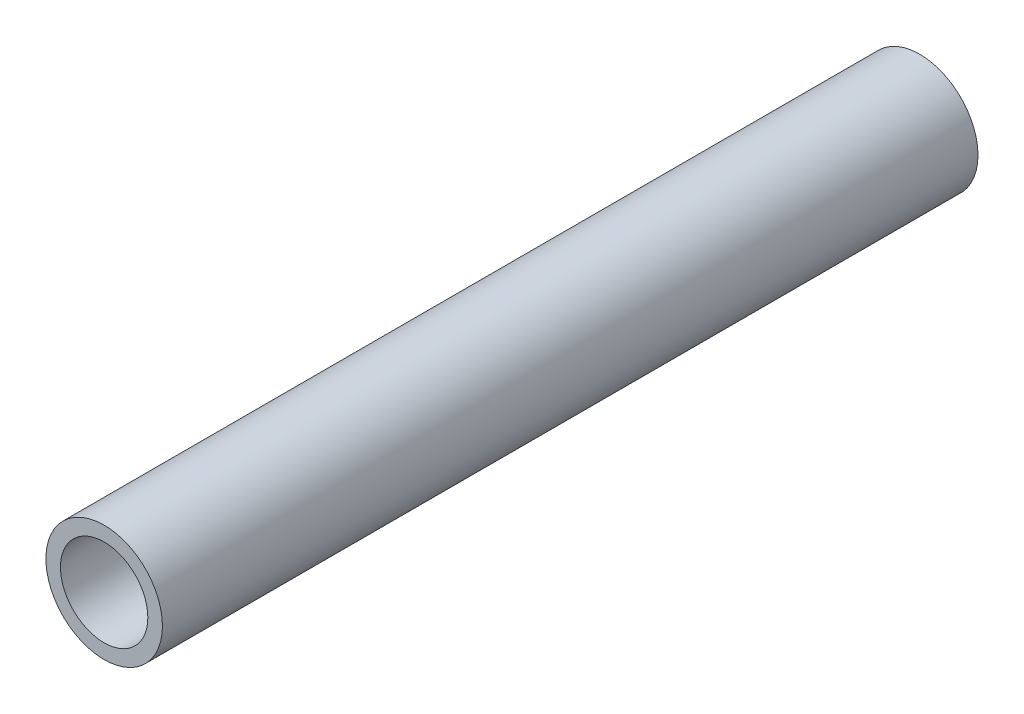
ISO-10303-21;
HEADER;
FILE_DESCRIPTION(('STEP AP214'),'2;1');
FILE_NAME('part.step','',(''),(''),'','','');
FILE_SCHEMA(('AUTOMOTIVE_DESIGN { 1 0 10303 214 1 1 1 1 }'));
ENDSEC;
DATA;
#1=APPLICATION_CONTEXT('core data for automotive mechanical design processes');
#2=APPLICATION_PROTOCOL_DEFINITION('international standard','automotive_design',2000,#1);
#3=PRODUCT_CONTEXT('',#1,'mechanical');
#4=PRODUCT('Part','Part','',(#3));
#5=PRODUCT_RELATED_PRODUCT_CATEGORY('part','',(#4));
#6=PRODUCT_DEFINITION_FORMATION('','',#4);
#7=PRODUCT_DEFINITION_CONTEXT('part definition',#1,'design');
#8=PRODUCT_DEFINITION('design','',#6,#7);
#9=PRODUCT_DEFINITION_SHAPE('','',#8);
#10=(LENGTH_UNIT() NAMED_UNIT(*) SI_UNIT(.MILLI.,.METRE.));
#11=(NAMED_UNIT(*) PLANE_ANGLE_UNIT() SI_UNIT($,.RADIAN.));
#12=(NAMED_UNIT(*) SI_UNIT($,.STERADIAN.) SOLID_ANGLE_UNIT());
#13=UNCERTAINTY_MEASURE_WITH_UNIT(LENGTH_MEASURE(1.E-05),#10,'distance_accuracy_value','');
#14=(GEOMETRIC_REPRESENTATION_CONTEXT(3) GLOBAL_UNCERTAINTY_ASSIGNED_CONTEXT((#13)) GLOBAL_UNIT_ASSIGNED_CONTEXT((#10,
#11,#12)) REPRESENTATION_CONTEXT('',''));
#15=CARTESIAN_POINT('',(0.,0.,0.));
#16=DIRECTION('',(0.,0.,1.));
#17=DIRECTION('',(1.,0.,0.));
#18=AXIS2_PLACEMENT_3D('',#15,#16,#17);
#19=CARTESIAN_POINT('',(0.,0.,280.));
#20=DIRECTION('',(0.,0.,-1.));
#21=DIRECTION('',(-1.,0.,0.));
#22=AXIS2_PLACEMENT_3D('',#19,#20,#21);
#23=CYLINDRICAL_SURFACE('',#22,20.);
#24=CARTESIAN_POINT('',(0.,0.,280.));
#25=DIRECTION('',(0.,0.,1.));
#26=DIRECTION('',(1.,0.,0.));
#27=AXIS2_PLACEMENT_3D('',#24,#25,#26);
#28=CIRCLE('',#27,20.);
#29=CARTESIAN_POINT('',(20.,0.,280.));
#30=VERTEX_POINT('',#29);
#31=EDGE_CURVE('E10',#30,#30,#28,.T.);
#32=ORIENTED_EDGE('',*,*,#31,.F.);
#33=EDGE_LOOP('',(#32));
#34=FACE_BOUND('',#33,.T.);
#35=CARTESIAN_POINT('',(0.,0.,0.));
#36=DIRECTION('',(0.,0.,1.));
#37=DIRECTION('',(1.,0.,0.));
#38=AXIS2_PLACEMENT_3D('',#35,#36,#37);
#39=CIRCLE('',#38,20.);
#40=CARTESIAN_POINT('',(20.,0.,0.));
#41=VERTEX_POINT('',#40);
#42=EDGE_CURVE('E44',#41,#41,#39,.T.);
#43=ORIENTED_EDGE('',*,*,#42,.T.);
#44=EDGE_LOOP('',(#43));
#45=FACE_BOUND('',#44,.T.);
#46=ADVANCED_FACE('F41',(#34,#45),#23,.T.);
#47=CARTESIAN_POINT('',(0.,0.,280.));
#48=DIRECTION('',(0.,0.,1.));
#49=DIRECTION('',(1.,0.,0.));
#50=AXIS2_PLACEMENT_3D('',#47,#48,#49);
#51=PLANE('',#50);
#52=CARTESIAN_POINT('',(0.,0.,280.));
#53=DIRECTION('',(0.,0.,1.));
#54=DIRECTION('',(1.,0.,0.));
#55=AXIS2_PLACEMENT_3D('',#52,#53,#54);
#56=CIRCLE('',#55,15.);
#57=CARTESIAN_POINT('',(15.,0.,280.));
#58=VERTEX_POINT('',#57);
#59=EDGE_CURVE('E53',#58,#58,#56,.T.);
#60=ORIENTED_EDGE('',*,*,#59,.F.);
#61=EDGE_LOOP('',(#60));
#62=FACE_BOUND('',#61,.T.);
#63=ORIENTED_EDGE('',*,*,#31,.T.);
#64=EDGE_LOOP('',(#63));
#65=FACE_BOUND('',#64,.T.);
#66=ADVANCED_FACE('F68',(#62,#65),#51,.T.);
#67=CARTESIAN_POINT('',(0.,0.,0.));
#68=DIRECTION('',(0.,0.,1.));
#69=DIRECTION('',(1.,0.,0.));
#70=AXIS2_PLACEMENT_3D('',#67,#68,#69);
#71=PLANE('',#70);
#72=CARTESIAN_POINT('',(0.,0.,0.));
#73=DIRECTION('',(0.,0.,1.));
#74=DIRECTION('',(1.,0.,0.));
#75=AXIS2_PLACEMENT_3D('',#72,#73,#74);
#76=CIRCLE('',#75,15.);
#77=CARTESIAN_POINT('',(15.,0.,0.));
#78=VERTEX_POINT('',#77);
#79=EDGE_CURVE('E51',#78,#78,#76,.T.);
#80=ORIENTED_EDGE('',*,*,#79,.T.);
#81=EDGE_LOOP('',(#80));
#82=FACE_BOUND('',#81,.T.);
#83=ORIENTED_EDGE('',*,*,#42,.F.);
#84=EDGE_LOOP('',(#83));
#85=FACE_BOUND('',#84,.T.);
#86=ADVANCED_FACE('F59',(#82,#85),#71,.F.);
#87=CARTESIAN_POINT('',(0.,0.,0.));
#88=DIRECTION('',(0.,0.,1.));
#89=DIRECTION('',(1.,0.,0.));
#90=AXIS2_PLACEMENT_3D('',#87,#88,#89);
#91=CYLINDRICAL_SURFACE('',#90,15.);
#92=ORIENTED_EDGE('',*,*,#79,.F.);
#93=EDGE_LOOP('',(#92));
#94=FACE_BOUND('',#93,.T.);
#95=ORIENTED_EDGE('',*,*,#59,.T.);
#96=EDGE_LOOP('',(#95));
#97=FACE_BOUND('',#96,.T.);
#98=ADVANCED_FACE('F62',(#94,#97),#91,.F.);
#99=CLOSED_SHELL('',(#46,#66,#86,#98));
#100=MANIFOLD_SOLID_BREP('B2',#99);
#101=ADVANCED_BREP_SHAPE_REPRESENTATION('',(#18,#100),#14);
#102=SHAPE_DEFINITION_REPRESENTATION(#9,#101);
ENDSEC;
END-ISO-10303-21;
